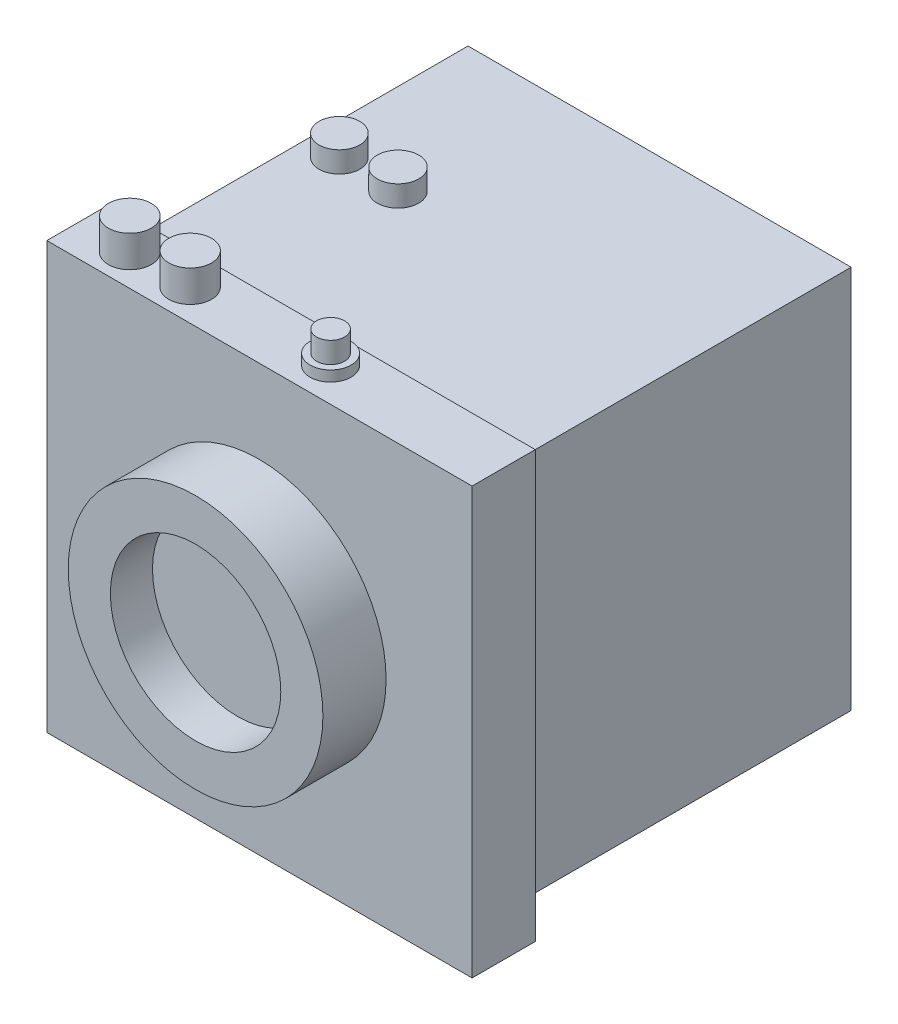
ISO-10303-21;
HEADER;
FILE_DESCRIPTION(('STEP AP214'),'2;1');
FILE_NAME('part.step','',(''),(''),'','','');
FILE_SCHEMA(('AUTOMOTIVE_DESIGN { 1 0 10303 214 1 1 1 1 }'));
ENDSEC;
DATA;
#1=APPLICATION_CONTEXT('core data for automotive mechanical design processes');
#2=APPLICATION_PROTOCOL_DEFINITION('international standard','automotive_design',2000,#1);
#3=PRODUCT_CONTEXT('',#1,'mechanical');
#4=PRODUCT('Part','Part','',(#3));
#5=PRODUCT_RELATED_PRODUCT_CATEGORY('part','',(#4));
#6=PRODUCT_DEFINITION_FORMATION('','',#4);
#7=PRODUCT_DEFINITION_CONTEXT('part definition',#1,'design');
#8=PRODUCT_DEFINITION('design','',#6,#7);
#9=PRODUCT_DEFINITION_SHAPE('','',#8);
#10=(LENGTH_UNIT() NAMED_UNIT(*) SI_UNIT(.MILLI.,.METRE.));
#11=(NAMED_UNIT(*) PLANE_ANGLE_UNIT() SI_UNIT($,.RADIAN.));
#12=(NAMED_UNIT(*) SI_UNIT($,.STERADIAN.) SOLID_ANGLE_UNIT());
#13=UNCERTAINTY_MEASURE_WITH_UNIT(LENGTH_MEASURE(1.E-05),#10,'distance_accuracy_value','');
#14=(GEOMETRIC_REPRESENTATION_CONTEXT(3) GLOBAL_UNCERTAINTY_ASSIGNED_CONTEXT((#13)) GLOBAL_UNIT_ASSIGNED_CONTEXT((#10,
#11,#12)) REPRESENTATION_CONTEXT('',''));
#15=CARTESIAN_POINT('',(0.,0.,0.));
#16=DIRECTION('',(0.,0.,1.));
#17=DIRECTION('',(1.,0.,0.));
#18=AXIS2_PLACEMENT_3D('',#15,#16,#17);
#19=CARTESIAN_POINT('',(18.5981593836394,25.6442125115192,-40.64));
#20=DIRECTION('',(-1.,0.,0.));
#21=DIRECTION('',(0.,0.,1.));
#22=AXIS2_PLACEMENT_3D('',#19,#20,#21);
#23=PLANE('',#22);
#24=DIRECTION('',(0.,-1.,0.));
#25=VECTOR('',#24,1.);
#26=CARTESIAN_POINT('',(18.5981593836394,25.6442125115192,5.08));
#27=LINE('',#26,#25);
#28=CARTESIAN_POINT('',(18.5981593836394,25.6442125115192,5.08));
#29=VERTEX_POINT('',#28);
#30=CARTESIAN_POINT('',(18.5981593836394,-20.6592497543797,5.08));
#31=VERTEX_POINT('',#30);
#32=EDGE_CURVE('E111',#29,#31,#27,.T.);
#33=ORIENTED_EDGE('',*,*,#32,.T.);
#34=DIRECTION('',(0.,0.,1.));
#35=VECTOR('',#34,1.);
#36=CARTESIAN_POINT('',(18.5981593836394,-20.6592497543797,-40.64));
#37=LINE('',#36,#35);
#38=CARTESIAN_POINT('',(18.5981593836394,-20.6592497543797,-40.64));
#39=VERTEX_POINT('',#38);
#40=EDGE_CURVE('E102',#39,#31,#37,.T.);
#41=ORIENTED_EDGE('',*,*,#40,.F.);
#42=DIRECTION('',(0.,-1.,0.));
#43=VECTOR('',#42,1.);
#44=CARTESIAN_POINT('',(18.5981593836394,25.6442125115192,-40.64));
#45=LINE('',#44,#43);
#46=CARTESIAN_POINT('',(18.5981593836394,25.6442125115192,-40.64));
#47=VERTEX_POINT('',#46);
#48=EDGE_CURVE('E96',#47,#39,#45,.T.);
#49=ORIENTED_EDGE('',*,*,#48,.F.);
#50=DIRECTION('',(0.,0.,1.));
#51=VECTOR('',#50,1.);
#52=CARTESIAN_POINT('',(18.5981593836394,25.6442125115192,-40.64));
#53=LINE('',#52,#51);
#54=EDGE_CURVE('E107',#47,#29,#53,.T.);
#55=ORIENTED_EDGE('',*,*,#54,.T.);
#56=EDGE_LOOP('',(#33,#41,#49,#55));
#57=FACE_BOUND('',#56,.T.);
#58=ADVANCED_FACE('F44',(#57),#23,.F.);
#59=CARTESIAN_POINT('',(18.5981593836394,-20.6592497543797,-40.64));
#60=DIRECTION('',(0.,1.,0.));
#61=DIRECTION('',(0.,0.,1.));
#62=AXIS2_PLACEMENT_3D('',#59,#60,#61);
#63=PLANE('',#62);
#64=DIRECTION('',(-1.,0.,0.));
#65=VECTOR('',#64,1.);
#66=CARTESIAN_POINT('',(18.5981593836394,-20.6592497543797,5.08));
#67=LINE('',#66,#65);
#68=CARTESIAN_POINT('',(-27.609438213853,-20.6592497543797,5.08));
#69=VERTEX_POINT('',#68);
#70=EDGE_CURVE('E101',#31,#69,#67,.T.);
#71=ORIENTED_EDGE('',*,*,#70,.T.);
#72=DIRECTION('',(0.,0.,1.));
#73=VECTOR('',#72,1.);
#74=CARTESIAN_POINT('',(-27.609438213853,-20.6592497543797,-40.64));
#75=LINE('',#74,#73);
#76=CARTESIAN_POINT('',(-27.609438213853,-20.6592497543797,-40.64));
#77=VERTEX_POINT('',#76);
#78=EDGE_CURVE('E99',#77,#69,#75,.T.);
#79=ORIENTED_EDGE('',*,*,#78,.F.);
#80=DIRECTION('',(-1.,0.,0.));
#81=VECTOR('',#80,1.);
#82=CARTESIAN_POINT('',(18.5981593836394,-20.6592497543797,-40.64));
#83=LINE('',#82,#81);
#84=EDGE_CURVE('E91',#39,#77,#83,.T.);
#85=ORIENTED_EDGE('',*,*,#84,.F.);
#86=ORIENTED_EDGE('',*,*,#40,.T.);
#87=EDGE_LOOP('',(#71,#79,#85,#86));
#88=FACE_BOUND('',#87,.T.);
#89=ADVANCED_FACE('F100',(#88),#63,.F.);
#90=CARTESIAN_POINT('',(-27.609438213853,25.6442125115192,-40.64));
#91=DIRECTION('',(1.,0.,0.));
#92=DIRECTION('',(0.,0.,-1.));
#93=AXIS2_PLACEMENT_3D('',#90,#91,#92);
#94=PLANE('',#93);
#95=DIRECTION('',(0.,1.,0.));
#96=VECTOR('',#95,1.);
#97=CARTESIAN_POINT('',(-27.609438213853,25.6442125115192,5.08));
#98=LINE('',#97,#96);
#99=CARTESIAN_POINT('',(-27.609438213853,25.6442125115192,5.08));
#100=VERTEX_POINT('',#99);
#101=EDGE_CURVE('E77',#69,#100,#98,.T.);
#102=ORIENTED_EDGE('',*,*,#101,.T.);
#103=DIRECTION('',(0.,0.,1.));
#104=VECTOR('',#103,1.);
#105=CARTESIAN_POINT('',(-27.609438213853,25.6442125115192,-40.64));
#106=LINE('',#105,#104);
#107=CARTESIAN_POINT('',(-27.609438213853,25.6442125115192,-40.64));
#108=VERTEX_POINT('',#107);
#109=EDGE_CURVE('E103',#108,#100,#106,.T.);
#110=ORIENTED_EDGE('',*,*,#109,.F.);
#111=DIRECTION('',(0.,1.,0.));
#112=VECTOR('',#111,1.);
#113=CARTESIAN_POINT('',(-27.609438213853,25.6442125115192,-40.64));
#114=LINE('',#113,#112);
#115=EDGE_CURVE('E94',#77,#108,#114,.T.);
#116=ORIENTED_EDGE('',*,*,#115,.F.);
#117=ORIENTED_EDGE('',*,*,#78,.T.);
#118=EDGE_LOOP('',(#102,#110,#116,#117));
#119=FACE_BOUND('',#118,.T.);
#120=ADVANCED_FACE('F105',(#119),#94,.F.);
#121=CARTESIAN_POINT('',(18.5981593836394,25.6442125115192,-40.64));
#122=DIRECTION('',(0.,-1.,0.));
#123=DIRECTION('',(0.,0.,-1.));
#124=AXIS2_PLACEMENT_3D('',#121,#122,#123);
#125=PLANE('',#124);
#126=CARTESIAN_POINT('',(-23.726555880001,25.6442125115192,-21.2409155723932));
#127=DIRECTION('',(0.,-1.,0.));
#128=DIRECTION('',(0.,0.,-1.));
#129=AXIS2_PLACEMENT_3D('',#126,#127,#128);
#130=CIRCLE('',#129,2.46277639949756);
#131=CARTESIAN_POINT('',(-23.726555880001,25.6442125115192,-23.7036919718908));
#132=VERTEX_POINT('',#131);
#133=EDGE_CURVE('E12',#132,#132,#130,.F.);
#134=ORIENTED_EDGE('',*,*,#133,.F.);
#135=EDGE_LOOP('',(#134));
#136=FACE_BOUND('',#135,.T.);
#137=CARTESIAN_POINT('',(-16.658967026462,25.6442125115192,-21.2409155723932));
#138=DIRECTION('',(0.,-1.,0.));
#139=DIRECTION('',(0.,0.,-1.));
#140=AXIS2_PLACEMENT_3D('',#137,#138,#139);
#141=CIRCLE('',#140,2.49669096869281);
#142=CARTESIAN_POINT('',(-16.658967026462,25.6442125115192,-23.737606541086));
#143=VERTEX_POINT('',#142);
#144=EDGE_CURVE('E52',#143,#143,#141,.F.);
#145=ORIENTED_EDGE('',*,*,#144,.F.);
#146=EDGE_LOOP('',(#145));
#147=FACE_BOUND('',#146,.T.);
#148=DIRECTION('',(1.,0.,0.));
#149=VECTOR('',#148,1.);
#150=CARTESIAN_POINT('',(18.5981593836394,25.6442125115192,5.08));
#151=LINE('',#150,#149);
#152=EDGE_CURVE('E83',#100,#29,#151,.T.);
#153=ORIENTED_EDGE('',*,*,#152,.T.);
#154=ORIENTED_EDGE('',*,*,#54,.F.);
#155=DIRECTION('',(1.,0.,0.));
#156=VECTOR('',#155,1.);
#157=CARTESIAN_POINT('',(18.5981593836394,25.6442125115192,-40.64));
#158=LINE('',#157,#156);
#159=EDGE_CURVE('E60',#108,#47,#158,.T.);
#160=ORIENTED_EDGE('',*,*,#159,.F.);
#161=ORIENTED_EDGE('',*,*,#109,.T.);
#162=EDGE_LOOP('',(#153,#154,#160,#161));
#163=FACE_BOUND('',#162,.T.);
#164=ADVANCED_FACE('F125',(#136,#147,#163),#125,.F.);
#165=CARTESIAN_POINT('',(0.,0.,-40.64));
#166=DIRECTION('',(0.,0.,-1.));
#167=DIRECTION('',(-1.,0.,0.));
#168=AXIS2_PLACEMENT_3D('',#165,#166,#167);
#169=PLANE('',#168);
#170=ORIENTED_EDGE('',*,*,#48,.T.);
#171=ORIENTED_EDGE('',*,*,#84,.T.);
#172=ORIENTED_EDGE('',*,*,#115,.T.);
#173=ORIENTED_EDGE('',*,*,#159,.T.);
#174=EDGE_LOOP('',(#170,#171,#172,#173));
#175=FACE_BOUND('',#174,.T.);
#176=ADVANCED_FACE('F92',(#175),#169,.T.);
#177=CARTESIAN_POINT('',(0.,0.,5.08));
#178=DIRECTION('',(0.,0.,-1.));
#179=DIRECTION('',(-1.,0.,0.));
#180=AXIS2_PLACEMENT_3D('',#177,#178,#179);
#181=PLANE('',#180);
#182=ORIENTED_EDGE('',*,*,#32,.F.);
#183=ORIENTED_EDGE('',*,*,#152,.F.);
#184=ORIENTED_EDGE('',*,*,#101,.F.);
#185=ORIENTED_EDGE('',*,*,#70,.F.);
#186=EDGE_LOOP('',(#182,#183,#184,#185));
#187=FACE_BOUND('',#186,.T.);
#188=ADVANCED_FACE('F133',(#187),#181,.F.);
#189=CARTESIAN_POINT('',(-16.658967026462,28.1842125115192,-21.2409155723932));
#190=DIRECTION('',(0.,-1.,0.));
#191=DIRECTION('',(0.,0.,-1.));
#192=AXIS2_PLACEMENT_3D('',#189,#190,#191);
#193=CYLINDRICAL_SURFACE('',#192,2.49669096869281);
#194=CARTESIAN_POINT('',(-16.658967026462,28.1842125115192,-21.2409155723932));
#195=DIRECTION('',(0.,1.,0.));
#196=DIRECTION('',(0.,0.,1.));
#197=AXIS2_PLACEMENT_3D('',#194,#195,#196);
#198=CIRCLE('',#197,2.49669096869281);
#199=CARTESIAN_POINT('',(-16.658967026462,28.1842125115192,-18.7442246037004));
#200=VERTEX_POINT('',#199);
#201=EDGE_CURVE('E114',#200,#200,#198,.T.);
#202=ORIENTED_EDGE('',*,*,#201,.F.);
#203=EDGE_LOOP('',(#202));
#204=FACE_BOUND('',#203,.T.);
#205=ORIENTED_EDGE('',*,*,#144,.T.);
#206=EDGE_LOOP('',(#205));
#207=FACE_BOUND('',#206,.T.);
#208=ADVANCED_FACE('F123',(#204,#207),#193,.T.);
#209=CARTESIAN_POINT('',(-16.658967026462,28.1842125115192,-21.2409155723932));
#210=DIRECTION('',(0.,1.,0.));
#211=DIRECTION('',(0.,0.,1.));
#212=AXIS2_PLACEMENT_3D('',#209,#210,#211);
#213=PLANE('',#212);
#214=ORIENTED_EDGE('',*,*,#201,.T.);
#215=EDGE_LOOP('',(#214));
#216=FACE_BOUND('',#215,.T.);
#217=ADVANCED_FACE('F149',(#216),#213,.T.);
#218=CARTESIAN_POINT('',(-23.726555880001,28.1842125115192,-21.2409155723932));
#219=DIRECTION('',(0.,-1.,0.));
#220=DIRECTION('',(0.,0.,-1.));
#221=AXIS2_PLACEMENT_3D('',#218,#219,#220);
#222=CYLINDRICAL_SURFACE('',#221,2.46277639949756);
#223=CARTESIAN_POINT('',(-23.726555880001,28.1842125115192,-21.2409155723932));
#224=DIRECTION('',(0.,1.,0.));
#225=DIRECTION('',(0.,0.,1.));
#226=AXIS2_PLACEMENT_3D('',#223,#224,#225);
#227=CIRCLE('',#226,2.46277639949756);
#228=CARTESIAN_POINT('',(-23.726555880001,28.1842125115192,-18.7781391728957));
#229=VERTEX_POINT('',#228);
#230=EDGE_CURVE('E167',#229,#229,#227,.T.);
#231=ORIENTED_EDGE('',*,*,#230,.F.);
#232=EDGE_LOOP('',(#231));
#233=FACE_BOUND('',#232,.T.);
#234=ORIENTED_EDGE('',*,*,#133,.T.);
#235=EDGE_LOOP('',(#234));
#236=FACE_BOUND('',#235,.T.);
#237=ADVANCED_FACE('F155',(#233,#236),#222,.T.);
#238=CARTESIAN_POINT('',(-23.726555880001,28.1842125115192,-21.2409155723932));
#239=DIRECTION('',(0.,1.,0.));
#240=DIRECTION('',(0.,0.,1.));
#241=AXIS2_PLACEMENT_3D('',#238,#239,#240);
#242=PLANE('',#241);
#243=ORIENTED_EDGE('',*,*,#230,.T.);
#244=EDGE_LOOP('',(#243));
#245=FACE_BOUND('',#244,.T.);
#246=ADVANCED_FACE('F159',(#245),#242,.T.);
#247=CLOSED_SHELL('',(#58,#89,#120,#164,#176,#188,#208,#217,#237,#246));
#248=MANIFOLD_SOLID_BREP('B2',#247);
#249=CARTESIAN_POINT('',(-30.149438213853,28.1842125115192,7.62));
#250=DIRECTION('',(1.,0.,0.));
#251=DIRECTION('',(0.,0.,-1.));
#252=AXIS2_PLACEMENT_3D('',#249,#250,#251);
#253=PLANE('',#252);
#254=DIRECTION('',(0.,-1.,0.));
#255=VECTOR('',#254,1.);
#256=CARTESIAN_POINT('',(-30.149438213853,28.1842125115192,0.));
#257=LINE('',#256,#255);
#258=CARTESIAN_POINT('',(-30.149438213853,28.1842125115192,0.));
#259=VERTEX_POINT('',#258);
#260=CARTESIAN_POINT('',(-30.149438213853,-23.1992497543797,0.));
#261=VERTEX_POINT('',#260);
#262=EDGE_CURVE('E324',#259,#261,#257,.T.);
#263=ORIENTED_EDGE('',*,*,#262,.T.);
#264=DIRECTION('',(0.,0.,-1.));
#265=VECTOR('',#264,1.);
#266=CARTESIAN_POINT('',(-30.149438213853,-23.1992497543797,7.62));
#267=LINE('',#266,#265);
#268=CARTESIAN_POINT('',(-30.149438213853,-23.1992497543797,7.62));
#269=VERTEX_POINT('',#268);
#270=EDGE_CURVE('E365',#269,#261,#267,.T.);
#271=ORIENTED_EDGE('',*,*,#270,.F.);
#272=DIRECTION('',(0.,-1.,0.));
#273=VECTOR('',#272,1.);
#274=CARTESIAN_POINT('',(-30.149438213853,28.1842125115192,7.62));
#275=LINE('',#274,#273);
#276=CARTESIAN_POINT('',(-30.149438213853,28.1842125115192,7.62));
#277=VERTEX_POINT('',#276);
#278=EDGE_CURVE('E348',#277,#269,#275,.T.);
#279=ORIENTED_EDGE('',*,*,#278,.F.);
#280=DIRECTION('',(0.,0.,-1.));
#281=VECTOR('',#280,1.);
#282=CARTESIAN_POINT('',(-30.149438213853,28.1842125115192,7.62));
#283=LINE('',#282,#281);
#284=EDGE_CURVE('E353',#277,#259,#283,.T.);
#285=ORIENTED_EDGE('',*,*,#284,.T.);
#286=EDGE_LOOP('',(#263,#271,#279,#285));
#287=FACE_BOUND('',#286,.T.);
#288=ADVANCED_FACE('F227',(#287),#253,.F.);
#289=CARTESIAN_POINT('',(-30.149438213853,-23.1992497543797,7.62));
#290=DIRECTION('',(0.,1.,0.));
#291=DIRECTION('',(0.,0.,1.));
#292=AXIS2_PLACEMENT_3D('',#289,#290,#291);
#293=PLANE('',#292);
#294=DIRECTION('',(1.,0.,0.));
#295=VECTOR('',#294,1.);
#296=CARTESIAN_POINT('',(-30.149438213853,-23.1992497543797,0.));
#297=LINE('',#296,#295);
#298=CARTESIAN_POINT('',(21.1381593836394,-23.1992497543797,0.));
#299=VERTEX_POINT('',#298);
#300=EDGE_CURVE('E328',#261,#299,#297,.T.);
#301=ORIENTED_EDGE('',*,*,#300,.T.);
#302=DIRECTION('',(0.,0.,-1.));
#303=VECTOR('',#302,1.);
#304=CARTESIAN_POINT('',(21.1381593836394,-23.1992497543797,7.62));
#305=LINE('',#304,#303);
#306=CARTESIAN_POINT('',(21.1381593836394,-23.1992497543797,7.62));
#307=VERTEX_POINT('',#306);
#308=EDGE_CURVE('E362',#307,#299,#305,.T.);
#309=ORIENTED_EDGE('',*,*,#308,.F.);
#310=DIRECTION('',(1.,0.,0.));
#311=VECTOR('',#310,1.);
#312=CARTESIAN_POINT('',(-30.149438213853,-23.1992497543797,7.62));
#313=LINE('',#312,#311);
#314=EDGE_CURVE('E279',#269,#307,#313,.T.);
#315=ORIENTED_EDGE('',*,*,#314,.F.);
#316=ORIENTED_EDGE('',*,*,#270,.T.);
#317=EDGE_LOOP('',(#301,#309,#315,#316));
#318=FACE_BOUND('',#317,.T.);
#319=ADVANCED_FACE('F400',(#318),#293,.F.);
#320=CARTESIAN_POINT('',(21.1381593836394,28.1842125115192,7.62));
#321=DIRECTION('',(-1.,0.,0.));
#322=DIRECTION('',(0.,0.,1.));
#323=AXIS2_PLACEMENT_3D('',#320,#321,#322);
#324=PLANE('',#323);
#325=DIRECTION('',(0.,1.,0.));
#326=VECTOR('',#325,1.);
#327=CARTESIAN_POINT('',(21.1381593836394,28.1842125115192,0.));
#328=LINE('',#327,#326);
#329=CARTESIAN_POINT('',(21.1381593836394,28.1842125115192,0.));
#330=VERTEX_POINT('',#329);
#331=EDGE_CURVE('E356',#299,#330,#328,.T.);
#332=ORIENTED_EDGE('',*,*,#331,.T.);
#333=DIRECTION('',(0.,0.,-1.));
#334=VECTOR('',#333,1.);
#335=CARTESIAN_POINT('',(21.1381593836394,28.1842125115192,7.62));
#336=LINE('',#335,#334);
#337=CARTESIAN_POINT('',(21.1381593836394,28.1842125115192,7.62));
#338=VERTEX_POINT('',#337);
#339=EDGE_CURVE('E360',#338,#330,#336,.T.);
#340=ORIENTED_EDGE('',*,*,#339,.F.);
#341=DIRECTION('',(0.,1.,0.));
#342=VECTOR('',#341,1.);
#343=CARTESIAN_POINT('',(21.1381593836394,28.1842125115192,7.62));
#344=LINE('',#343,#342);
#345=EDGE_CURVE('E351',#307,#338,#344,.T.);
#346=ORIENTED_EDGE('',*,*,#345,.F.);
#347=ORIENTED_EDGE('',*,*,#308,.T.);
#348=EDGE_LOOP('',(#332,#340,#346,#347));
#349=FACE_BOUND('',#348,.T.);
#350=ADVANCED_FACE('F378',(#349),#324,.F.);
#351=CARTESIAN_POINT('',(-30.149438213853,28.1842125115192,7.62));
#352=DIRECTION('',(0.,-1.,0.));
#353=DIRECTION('',(0.,0.,-1.));
#354=AXIS2_PLACEMENT_3D('',#351,#352,#353);
#355=PLANE('',#354);
#356=CARTESIAN_POINT('',(0.,28.1842125115192,3.54649215938536));
#357=DIRECTION('',(0.,-1.,0.));
#358=DIRECTION('',(0.,0.,-1.));
#359=AXIS2_PLACEMENT_3D('',#356,#357,#358);
#360=CIRCLE('',#359,2.47493998663768);
#361=CARTESIAN_POINT('',(0.,28.1842125115192,1.07155217274768));
#362=VERTEX_POINT('',#361);
#363=EDGE_CURVE('E42',#362,#362,#360,.F.);
#364=ORIENTED_EDGE('',*,*,#363,.F.);
#365=EDGE_LOOP('',(#364));
#366=FACE_BOUND('',#365,.T.);
#367=CARTESIAN_POINT('',(-16.6467206612765,28.1842125115192,3.83516268479154));
#368=DIRECTION('',(0.,-1.,0.));
#369=DIRECTION('',(0.,0.,-1.));
#370=AXIS2_PLACEMENT_3D('',#367,#368,#369);
#371=CIRCLE('',#370,2.57663315248742);
#372=CARTESIAN_POINT('',(-16.6467206612765,28.1842125115192,1.25852953230412));
#373=VERTEX_POINT('',#372);
#374=EDGE_CURVE('E234',#373,#373,#371,.F.);
#375=ORIENTED_EDGE('',*,*,#374,.F.);
#376=EDGE_LOOP('',(#375));
#377=FACE_BOUND('',#376,.T.);
#378=CARTESIAN_POINT('',(-23.9248216600902,28.1842125115192,3.83516268479154));
#379=DIRECTION('',(0.,-1.,0.));
#380=DIRECTION('',(0.,0.,-1.));
#381=AXIS2_PLACEMENT_3D('',#378,#379,#380);
#382=CIRCLE('',#381,2.58975372963926);
#383=CARTESIAN_POINT('',(-23.9248216600902,28.1842125115192,1.24540895515228));
#384=VERTEX_POINT('',#383);
#385=EDGE_CURVE('E367',#384,#384,#382,.F.);
#386=ORIENTED_EDGE('',*,*,#385,.F.);
#387=EDGE_LOOP('',(#386));
#388=FACE_BOUND('',#387,.T.);
#389=DIRECTION('',(-1.,0.,0.));
#390=VECTOR('',#389,1.);
#391=CARTESIAN_POINT('',(-30.149438213853,28.1842125115192,0.));
#392=LINE('',#391,#390);
#393=EDGE_CURVE('E271',#330,#259,#392,.T.);
#394=ORIENTED_EDGE('',*,*,#393,.T.);
#395=ORIENTED_EDGE('',*,*,#284,.F.);
#396=DIRECTION('',(-1.,0.,0.));
#397=VECTOR('',#396,1.);
#398=CARTESIAN_POINT('',(-30.149438213853,28.1842125115192,7.62));
#399=LINE('',#398,#397);
#400=EDGE_CURVE('E250',#338,#277,#399,.T.);
#401=ORIENTED_EDGE('',*,*,#400,.F.);
#402=ORIENTED_EDGE('',*,*,#339,.T.);
#403=EDGE_LOOP('',(#394,#395,#401,#402));
#404=FACE_BOUND('',#403,.T.);
#405=ADVANCED_FACE('F374',(#366,#377,#388,#404),#355,.F.);
#406=CARTESIAN_POINT('',(0.,0.,7.62));
#407=DIRECTION('',(0.,0.,1.));
#408=DIRECTION('',(1.,0.,0.));
#409=AXIS2_PLACEMENT_3D('',#406,#407,#408);
#410=PLANE('',#409);
#411=CARTESIAN_POINT('',(-4.59097054054097,2.78421251151919,7.62));
#412=DIRECTION('',(0.,0.,1.));
#413=DIRECTION('',(1.,0.,0.));
#414=AXIS2_PLACEMENT_3D('',#411,#412,#413);
#415=CIRCLE('',#414,15.3566084359298);
#416=CARTESIAN_POINT('',(10.7656378953889,2.78421251151919,7.62));
#417=VERTEX_POINT('',#416);
#418=EDGE_CURVE('E333',#417,#417,#415,.T.);
#419=ORIENTED_EDGE('',*,*,#418,.F.);
#420=EDGE_LOOP('',(#419));
#421=FACE_BOUND('',#420,.T.);
#422=ORIENTED_EDGE('',*,*,#278,.T.);
#423=ORIENTED_EDGE('',*,*,#314,.T.);
#424=ORIENTED_EDGE('',*,*,#345,.T.);
#425=ORIENTED_EDGE('',*,*,#400,.T.);
#426=EDGE_LOOP('',(#422,#423,#424,#425));
#427=FACE_BOUND('',#426,.T.);
#428=ADVANCED_FACE('F377',(#421,#427),#410,.T.);
#429=CARTESIAN_POINT('',(0.,0.,0.));
#430=DIRECTION('',(0.,0.,1.));
#431=DIRECTION('',(1.,0.,0.));
#432=AXIS2_PLACEMENT_3D('',#429,#430,#431);
#433=PLANE('',#432);
#434=DIRECTION('',(-1.,0.,0.));
#435=VECTOR('',#434,1.);
#436=CARTESIAN_POINT('',(-30.149438213853,25.6442125115192,0.));
#437=LINE('',#436,#435);
#438=CARTESIAN_POINT('',(18.5981593836394,25.6442125115192,0.));
#439=VERTEX_POINT('',#438);
#440=CARTESIAN_POINT('',(-27.609438213853,25.6442125115192,0.));
#441=VERTEX_POINT('',#440);
#442=EDGE_CURVE('E319',#439,#441,#437,.T.);
#443=ORIENTED_EDGE('',*,*,#442,.T.);
#444=DIRECTION('',(0.,-1.,0.));
#445=VECTOR('',#444,1.);
#446=CARTESIAN_POINT('',(-27.609438213853,28.1842125115192,0.));
#447=LINE('',#446,#445);
#448=CARTESIAN_POINT('',(-27.609438213853,-20.6592497543797,0.));
#449=VERTEX_POINT('',#448);
#450=EDGE_CURVE('E341',#441,#449,#447,.T.);
#451=ORIENTED_EDGE('',*,*,#450,.T.);
#452=DIRECTION('',(1.,0.,0.));
#453=VECTOR('',#452,1.);
#454=CARTESIAN_POINT('',(-30.149438213853,-20.6592497543797,0.));
#455=LINE('',#454,#453);
#456=CARTESIAN_POINT('',(18.5981593836394,-20.6592497543797,0.));
#457=VERTEX_POINT('',#456);
#458=EDGE_CURVE('E323',#449,#457,#455,.T.);
#459=ORIENTED_EDGE('',*,*,#458,.T.);
#460=DIRECTION('',(0.,1.,0.));
#461=VECTOR('',#460,1.);
#462=CARTESIAN_POINT('',(18.5981593836394,28.1842125115192,0.));
#463=LINE('',#462,#461);
#464=EDGE_CURVE('E241',#457,#439,#463,.T.);
#465=ORIENTED_EDGE('',*,*,#464,.T.);
#466=EDGE_LOOP('',(#443,#451,#459,#465));
#467=FACE_BOUND('',#466,.T.);
#468=ORIENTED_EDGE('',*,*,#262,.F.);
#469=ORIENTED_EDGE('',*,*,#393,.F.);
#470=ORIENTED_EDGE('',*,*,#331,.F.);
#471=ORIENTED_EDGE('',*,*,#300,.F.);
#472=EDGE_LOOP('',(#468,#469,#470,#471));
#473=FACE_BOUND('',#472,.T.);
#474=ADVANCED_FACE('F409',(#467,#473),#433,.F.);
#475=CARTESIAN_POINT('',(-27.609438213853,28.1842125115192,7.62));
#476=DIRECTION('',(1.,0.,0.));
#477=DIRECTION('',(0.,0.,-1.));
#478=AXIS2_PLACEMENT_3D('',#475,#476,#477);
#479=PLANE('',#478);
#480=ORIENTED_EDGE('',*,*,#450,.F.);
#481=DIRECTION('',(0.,0.,-1.));
#482=VECTOR('',#481,1.);
#483=CARTESIAN_POINT('',(-27.609438213853,25.6442125115192,7.62));
#484=LINE('',#483,#482);
#485=CARTESIAN_POINT('',(-27.609438213853,25.6442125115192,5.08));
#486=VERTEX_POINT('',#485);
#487=EDGE_CURVE('E318',#486,#441,#484,.T.);
#488=ORIENTED_EDGE('',*,*,#487,.F.);
#489=DIRECTION('',(0.,-1.,0.));
#490=VECTOR('',#489,1.);
#491=CARTESIAN_POINT('',(-27.609438213853,28.1842125115192,5.08));
#492=LINE('',#491,#490);
#493=CARTESIAN_POINT('',(-27.609438213853,-20.6592497543797,5.08));
#494=VERTEX_POINT('',#493);
#495=EDGE_CURVE('E306',#486,#494,#492,.T.);
#496=ORIENTED_EDGE('',*,*,#495,.T.);
#497=DIRECTION('',(0.,0.,-1.));
#498=VECTOR('',#497,1.);
#499=CARTESIAN_POINT('',(-27.609438213853,-20.6592497543797,7.62));
#500=LINE('',#499,#498);
#501=EDGE_CURVE('E316',#494,#449,#500,.T.);
#502=ORIENTED_EDGE('',*,*,#501,.T.);
#503=EDGE_LOOP('',(#480,#488,#496,#502));
#504=FACE_BOUND('',#503,.T.);
#505=ADVANCED_FACE('F315',(#504),#479,.T.);
#506=CARTESIAN_POINT('',(-30.149438213853,-20.6592497543797,7.62));
#507=DIRECTION('',(0.,1.,0.));
#508=DIRECTION('',(0.,0.,1.));
#509=AXIS2_PLACEMENT_3D('',#506,#507,#508);
#510=PLANE('',#509);
#511=ORIENTED_EDGE('',*,*,#458,.F.);
#512=ORIENTED_EDGE('',*,*,#501,.F.);
#513=DIRECTION('',(1.,0.,0.));
#514=VECTOR('',#513,1.);
#515=CARTESIAN_POINT('',(-30.149438213853,-20.6592497543797,5.08));
#516=LINE('',#515,#514);
#517=CARTESIAN_POINT('',(18.5981593836394,-20.6592497543797,5.08));
#518=VERTEX_POINT('',#517);
#519=EDGE_CURVE('E302',#494,#518,#516,.T.);
#520=ORIENTED_EDGE('',*,*,#519,.T.);
#521=DIRECTION('',(0.,0.,-1.));
#522=VECTOR('',#521,1.);
#523=CARTESIAN_POINT('',(18.5981593836394,-20.6592497543797,7.62));
#524=LINE('',#523,#522);
#525=EDGE_CURVE('E325',#518,#457,#524,.T.);
#526=ORIENTED_EDGE('',*,*,#525,.T.);
#527=EDGE_LOOP('',(#511,#512,#520,#526));
#528=FACE_BOUND('',#527,.T.);
#529=ADVANCED_FACE('F321',(#528),#510,.T.);
#530=CARTESIAN_POINT('',(18.5981593836394,28.1842125115192,7.62));
#531=DIRECTION('',(-1.,0.,0.));
#532=DIRECTION('',(0.,0.,1.));
#533=AXIS2_PLACEMENT_3D('',#530,#531,#532);
#534=PLANE('',#533);
#535=ORIENTED_EDGE('',*,*,#464,.F.);
#536=ORIENTED_EDGE('',*,*,#525,.F.);
#537=DIRECTION('',(0.,1.,0.));
#538=VECTOR('',#537,1.);
#539=CARTESIAN_POINT('',(18.5981593836394,28.1842125115192,5.08));
#540=LINE('',#539,#538);
#541=CARTESIAN_POINT('',(18.5981593836394,25.6442125115192,5.08));
#542=VERTEX_POINT('',#541);
#543=EDGE_CURVE('E307',#518,#542,#540,.T.);
#544=ORIENTED_EDGE('',*,*,#543,.T.);
#545=DIRECTION('',(0.,0.,-1.));
#546=VECTOR('',#545,1.);
#547=CARTESIAN_POINT('',(18.5981593836394,25.6442125115192,7.62));
#548=LINE('',#547,#546);
#549=EDGE_CURVE('E330',#542,#439,#548,.T.);
#550=ORIENTED_EDGE('',*,*,#549,.T.);
#551=EDGE_LOOP('',(#535,#536,#544,#550));
#552=FACE_BOUND('',#551,.T.);
#553=ADVANCED_FACE('F535',(#552),#534,.T.);
#554=CARTESIAN_POINT('',(-30.149438213853,25.6442125115192,7.62));
#555=DIRECTION('',(0.,-1.,0.));
#556=DIRECTION('',(0.,0.,-1.));
#557=AXIS2_PLACEMENT_3D('',#554,#555,#556);
#558=PLANE('',#557);
#559=ORIENTED_EDGE('',*,*,#442,.F.);
#560=ORIENTED_EDGE('',*,*,#549,.F.);
#561=DIRECTION('',(-1.,0.,0.));
#562=VECTOR('',#561,1.);
#563=CARTESIAN_POINT('',(-30.149438213853,25.6442125115192,5.08));
#564=LINE('',#563,#562);
#565=EDGE_CURVE('E336',#542,#486,#564,.T.);
#566=ORIENTED_EDGE('',*,*,#565,.T.);
#567=ORIENTED_EDGE('',*,*,#487,.T.);
#568=EDGE_LOOP('',(#559,#560,#566,#567));
#569=FACE_BOUND('',#568,.T.);
#570=ADVANCED_FACE('F528',(#569),#558,.T.);
#571=CARTESIAN_POINT('',(0.,0.,5.08));
#572=DIRECTION('',(0.,0.,1.));
#573=DIRECTION('',(1.,0.,0.));
#574=AXIS2_PLACEMENT_3D('',#571,#572,#573);
#575=PLANE('',#574);
#576=ORIENTED_EDGE('',*,*,#495,.F.);
#577=ORIENTED_EDGE('',*,*,#565,.F.);
#578=ORIENTED_EDGE('',*,*,#543,.F.);
#579=ORIENTED_EDGE('',*,*,#519,.F.);
#580=EDGE_LOOP('',(#576,#577,#578,#579));
#581=FACE_BOUND('',#580,.T.);
#582=ADVANCED_FACE('F304',(#581),#575,.F.);
#583=CARTESIAN_POINT('',(-4.59097054054097,2.78421251151919,15.24));
#584=DIRECTION('',(0.,0.,-1.));
#585=DIRECTION('',(-1.,0.,0.));
#586=AXIS2_PLACEMENT_3D('',#583,#584,#585);
#587=CYLINDRICAL_SURFACE('',#586,15.3566084359298);
#588=CARTESIAN_POINT('',(-4.59097054054097,2.78421251151919,15.24));
#589=DIRECTION('',(0.,0.,1.));
#590=DIRECTION('',(1.,0.,0.));
#591=AXIS2_PLACEMENT_3D('',#588,#589,#590);
#592=CIRCLE('',#591,15.3566084359298);
#593=CARTESIAN_POINT('',(10.7656378953889,2.78421251151919,15.24));
#594=VERTEX_POINT('',#593);
#595=EDGE_CURVE('E343',#594,#594,#592,.T.);
#596=ORIENTED_EDGE('',*,*,#595,.F.);
#597=EDGE_LOOP('',(#596));
#598=FACE_BOUND('',#597,.T.);
#599=ORIENTED_EDGE('',*,*,#418,.T.);
#600=EDGE_LOOP('',(#599));
#601=FACE_BOUND('',#600,.T.);
#602=ADVANCED_FACE('F517',(#598,#601),#587,.T.);
#603=CARTESIAN_POINT('',(-4.59097054054097,2.78421251151919,15.24));
#604=DIRECTION('',(0.,0.,1.));
#605=DIRECTION('',(1.,0.,0.));
#606=AXIS2_PLACEMENT_3D('',#603,#604,#605);
#607=PLANE('',#606);
#608=CARTESIAN_POINT('',(-4.59097054054097,2.78421251151919,15.24));
#609=DIRECTION('',(0.,0.,1.));
#610=DIRECTION('',(1.,0.,0.));
#611=AXIS2_PLACEMENT_3D('',#608,#609,#610);
#612=CIRCLE('',#611,10.2766084359298);
#613=CARTESIAN_POINT('',(5.68563789538887,2.78421251151919,15.24));
#614=VERTEX_POINT('',#613);
#615=EDGE_CURVE('E501',#614,#614,#612,.T.);
#616=ORIENTED_EDGE('',*,*,#615,.F.);
#617=EDGE_LOOP('',(#616));
#618=FACE_BOUND('',#617,.T.);
#619=ORIENTED_EDGE('',*,*,#595,.T.);
#620=EDGE_LOOP('',(#619));
#621=FACE_BOUND('',#620,.T.);
#622=ADVANCED_FACE('F519',(#618,#621),#607,.T.);
#623=CARTESIAN_POINT('',(-4.59097054054097,2.78421251151919,15.24));
#624=DIRECTION('',(0.,0.,-1.));
#625=DIRECTION('',(-1.,0.,0.));
#626=AXIS2_PLACEMENT_3D('',#623,#624,#625);
#627=CYLINDRICAL_SURFACE('',#626,10.2766084359298);
#628=ORIENTED_EDGE('',*,*,#615,.T.);
#629=EDGE_LOOP('',(#628));
#630=FACE_BOUND('',#629,.T.);
#631=CARTESIAN_POINT('',(-4.59097054054097,2.78421251151919,10.16));
#632=DIRECTION('',(0.,0.,1.));
#633=DIRECTION('',(1.,0.,0.));
#634=AXIS2_PLACEMENT_3D('',#631,#632,#633);
#635=CIRCLE('',#634,10.2766084359298);
#636=CARTESIAN_POINT('',(5.68563789538887,2.78421251151919,10.16));
#637=VERTEX_POINT('',#636);
#638=EDGE_CURVE('E510',#637,#637,#635,.T.);
#639=ORIENTED_EDGE('',*,*,#638,.F.);
#640=EDGE_LOOP('',(#639));
#641=FACE_BOUND('',#640,.T.);
#642=ADVANCED_FACE('F395',(#630,#641),#627,.F.);
#643=CARTESIAN_POINT('',(0.,0.,10.16));
#644=DIRECTION('',(0.,0.,1.));
#645=DIRECTION('',(1.,0.,0.));
#646=AXIS2_PLACEMENT_3D('',#643,#644,#645);
#647=PLANE('',#646);
#648=ORIENTED_EDGE('',*,*,#638,.T.);
#649=EDGE_LOOP('',(#648));
#650=FACE_BOUND('',#649,.T.);
#651=ADVANCED_FACE('F386',(#650),#647,.T.);
#652=CARTESIAN_POINT('',(-23.9248216600902,31.9942125115192,3.83516268479154));
#653=DIRECTION('',(0.,-1.,0.));
#654=DIRECTION('',(0.,0.,-1.));
#655=AXIS2_PLACEMENT_3D('',#652,#653,#654);
#656=CYLINDRICAL_SURFACE('',#655,2.58975372963926);
#657=CARTESIAN_POINT('',(-23.9248216600902,31.9942125115192,3.83516268479154));
#658=DIRECTION('',(0.,1.,0.));
#659=DIRECTION('',(0.,0.,1.));
#660=AXIS2_PLACEMENT_3D('',#657,#658,#659);
#661=CIRCLE('',#660,2.58975372963926);
#662=CARTESIAN_POINT('',(-23.9248216600902,31.9942125115192,6.4249164144308));
#663=VERTEX_POINT('',#662);
#664=EDGE_CURVE('E497',#663,#663,#661,.T.);
#665=ORIENTED_EDGE('',*,*,#664,.F.);
#666=EDGE_LOOP('',(#665));
#667=FACE_BOUND('',#666,.T.);
#668=ORIENTED_EDGE('',*,*,#385,.T.);
#669=EDGE_LOOP('',(#668));
#670=FACE_BOUND('',#669,.T.);
#671=ADVANCED_FACE('F383',(#667,#670),#656,.T.);
#672=CARTESIAN_POINT('',(-23.9248216600902,31.9942125115192,3.83516268479154));
#673=DIRECTION('',(0.,1.,0.));
#674=DIRECTION('',(0.,0.,1.));
#675=AXIS2_PLACEMENT_3D('',#672,#673,#674);
#676=PLANE('',#675);
#677=ORIENTED_EDGE('',*,*,#664,.T.);
#678=EDGE_LOOP('',(#677));
#679=FACE_BOUND('',#678,.T.);
#680=ADVANCED_FACE('F385',(#679),#676,.T.);
#681=CARTESIAN_POINT('',(-16.6467206612765,31.9942125115192,3.83516268479154));
#682=DIRECTION('',(0.,-1.,0.));
#683=DIRECTION('',(0.,0.,-1.));
#684=AXIS2_PLACEMENT_3D('',#681,#682,#683);
#685=CYLINDRICAL_SURFACE('',#684,2.57663315248742);
#686=CARTESIAN_POINT('',(-16.6467206612765,31.9942125115192,3.83516268479154));
#687=DIRECTION('',(0.,1.,0.));
#688=DIRECTION('',(0.,0.,1.));
#689=AXIS2_PLACEMENT_3D('',#686,#687,#688);
#690=CIRCLE('',#689,2.57663315248742);
#691=CARTESIAN_POINT('',(-16.6467206612765,31.9942125115192,6.41179583727896));
#692=VERTEX_POINT('',#691);
#693=EDGE_CURVE('E496',#692,#692,#690,.T.);
#694=ORIENTED_EDGE('',*,*,#693,.F.);
#695=EDGE_LOOP('',(#694));
#696=FACE_BOUND('',#695,.T.);
#697=ORIENTED_EDGE('',*,*,#374,.T.);
#698=EDGE_LOOP('',(#697));
#699=FACE_BOUND('',#698,.T.);
#700=ADVANCED_FACE('F372',(#696,#699),#685,.T.);
#701=CARTESIAN_POINT('',(-16.6467206612765,31.9942125115192,3.83516268479154));
#702=DIRECTION('',(0.,1.,0.));
#703=DIRECTION('',(0.,0.,1.));
#704=AXIS2_PLACEMENT_3D('',#701,#702,#703);
#705=PLANE('',#704);
#706=ORIENTED_EDGE('',*,*,#693,.T.);
#707=EDGE_LOOP('',(#706));
#708=FACE_BOUND('',#707,.T.);
#709=ADVANCED_FACE('F443',(#708),#705,.T.);
#710=CARTESIAN_POINT('',(0.,29.4542125115192,3.54649215938536));
#711=DIRECTION('',(0.,-1.,0.));
#712=DIRECTION('',(0.,0.,-1.));
#713=AXIS2_PLACEMENT_3D('',#710,#711,#712);
#714=CYLINDRICAL_SURFACE('',#713,2.47493998663768);
#715=CARTESIAN_POINT('',(0.,29.4542125115192,3.54649215938536));
#716=DIRECTION('',(0.,1.,0.));
#717=DIRECTION('',(0.,0.,1.));
#718=AXIS2_PLACEMENT_3D('',#715,#716,#717);
#719=CIRCLE('',#718,2.47493998663768);
#720=CARTESIAN_POINT('',(0.,29.4542125115192,6.02143214602304));
#721=VERTEX_POINT('',#720);
#722=EDGE_CURVE('E498',#721,#721,#719,.T.);
#723=ORIENTED_EDGE('',*,*,#722,.F.);
#724=EDGE_LOOP('',(#723));
#725=FACE_BOUND('',#724,.T.);
#726=ORIENTED_EDGE('',*,*,#363,.T.);
#727=EDGE_LOOP('',(#726));
#728=FACE_BOUND('',#727,.T.);
#729=ADVANCED_FACE('F448',(#725,#728),#714,.T.);
#730=CARTESIAN_POINT('',(0.,29.4542125115192,3.54649215938536));
#731=DIRECTION('',(0.,1.,0.));
#732=DIRECTION('',(0.,0.,1.));
#733=AXIS2_PLACEMENT_3D('',#730,#731,#732);
#734=PLANE('',#733);
#735=CARTESIAN_POINT('',(0.,29.4542125115192,3.54649215938536));
#736=DIRECTION('',(0.,1.,0.));
#737=DIRECTION('',(0.,0.,1.));
#738=AXIS2_PLACEMENT_3D('',#735,#736,#737);
#739=CIRCLE('',#738,1.68897341506204);
#740=CARTESIAN_POINT('',(0.,29.4542125115192,5.23546557444739));
#741=VERTEX_POINT('',#740);
#742=EDGE_CURVE('E622',#741,#741,#739,.T.);
#743=ORIENTED_EDGE('',*,*,#742,.F.);
#744=EDGE_LOOP('',(#743));
#745=FACE_BOUND('',#744,.T.);
#746=ORIENTED_EDGE('',*,*,#722,.T.);
#747=EDGE_LOOP('',(#746));
#748=FACE_BOUND('',#747,.T.);
#749=ADVANCED_FACE('F453',(#745,#748),#734,.T.);
#750=CARTESIAN_POINT('',(0.,31.9942125115192,3.54649215938536));
#751=DIRECTION('',(0.,-1.,0.));
#752=DIRECTION('',(0.,0.,-1.));
#753=AXIS2_PLACEMENT_3D('',#750,#751,#752);
#754=CYLINDRICAL_SURFACE('',#753,1.68897341506204);
#755=CARTESIAN_POINT('',(0.,31.9942125115192,3.54649215938536));
#756=DIRECTION('',(0.,1.,0.));
#757=DIRECTION('',(0.,0.,1.));
#758=AXIS2_PLACEMENT_3D('',#755,#756,#757);
#759=CIRCLE('',#758,1.68897341506204);
#760=CARTESIAN_POINT('',(0.,31.9942125115192,5.23546557444739));
#761=VERTEX_POINT('',#760);
#762=EDGE_CURVE('E504',#761,#761,#759,.T.);
#763=ORIENTED_EDGE('',*,*,#762,.F.);
#764=EDGE_LOOP('',(#763));
#765=FACE_BOUND('',#764,.T.);
#766=ORIENTED_EDGE('',*,*,#742,.T.);
#767=EDGE_LOOP('',(#766));
#768=FACE_BOUND('',#767,.T.);
#769=ADVANCED_FACE('F463',(#765,#768),#754,.T.);
#770=CARTESIAN_POINT('',(0.,31.9942125115192,3.54649215938536));
#771=DIRECTION('',(0.,1.,0.));
#772=DIRECTION('',(0.,0.,1.));
#773=AXIS2_PLACEMENT_3D('',#770,#771,#772);
#774=PLANE('',#773);
#775=ORIENTED_EDGE('',*,*,#762,.T.);
#776=EDGE_LOOP('',(#775));
#777=FACE_BOUND('',#776,.T.);
#778=ADVANCED_FACE('F473',(#777),#774,.T.);
#779=CLOSED_SHELL('',(#288,#319,#350,#405,#428,#474,#505,#529,#553,#570,#582,#602,#622,#642,
#651,#671,#680,#700,#709,#729,#749,#769,#778));
#780=MANIFOLD_SOLID_BREP('B6',#779);
#781=ADVANCED_BREP_SHAPE_REPRESENTATION('',(#18,#248,#780),#14);
#782=SHAPE_DEFINITION_REPRESENTATION(#9,#781);
ENDSEC;
END-ISO-10303-21;
